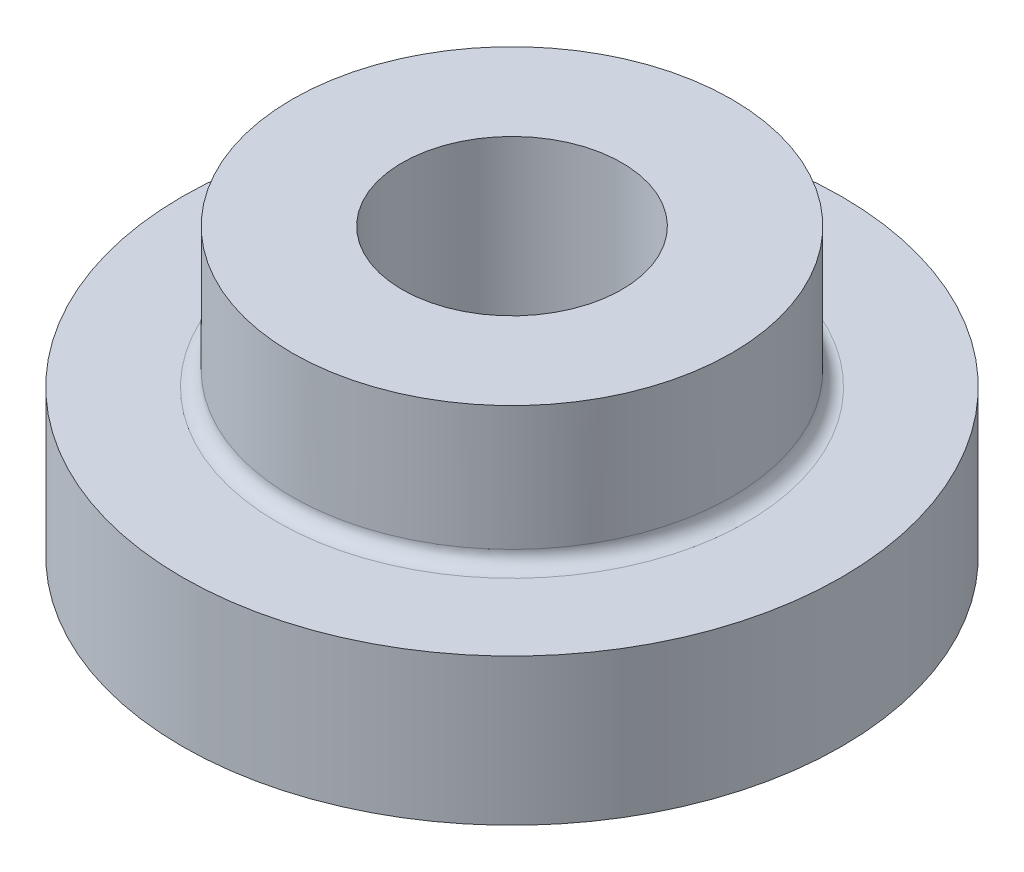
ISO-10303-21;
HEADER;
FILE_DESCRIPTION(('STEP AP214'),'2;1');
FILE_NAME('part.step','',(''),(''),'','','');
FILE_SCHEMA(('AUTOMOTIVE_DESIGN { 1 0 10303 214 1 1 1 1 }'));
ENDSEC;
DATA;
#1=APPLICATION_CONTEXT('core data for automotive mechanical design processes');
#2=APPLICATION_PROTOCOL_DEFINITION('international standard','automotive_design',2000,#1);
#3=PRODUCT_CONTEXT('',#1,'mechanical');
#4=PRODUCT('Part','Part','',(#3));
#5=PRODUCT_RELATED_PRODUCT_CATEGORY('part','',(#4));
#6=PRODUCT_DEFINITION_FORMATION('','',#4);
#7=PRODUCT_DEFINITION_CONTEXT('part definition',#1,'design');
#8=PRODUCT_DEFINITION('design','',#6,#7);
#9=PRODUCT_DEFINITION_SHAPE('','',#8);
#10=(LENGTH_UNIT() NAMED_UNIT(*) SI_UNIT(.MILLI.,.METRE.));
#11=(NAMED_UNIT(*) PLANE_ANGLE_UNIT() SI_UNIT($,.RADIAN.));
#12=(NAMED_UNIT(*) SI_UNIT($,.STERADIAN.) SOLID_ANGLE_UNIT());
#13=UNCERTAINTY_MEASURE_WITH_UNIT(LENGTH_MEASURE(1.E-05),#10,'distance_accuracy_value','');
#14=(GEOMETRIC_REPRESENTATION_CONTEXT(3) GLOBAL_UNCERTAINTY_ASSIGNED_CONTEXT((#13)) GLOBAL_UNIT_ASSIGNED_CONTEXT((#10,
#11,#12)) REPRESENTATION_CONTEXT('',''));
#15=CARTESIAN_POINT('',(0.,0.,0.));
#16=DIRECTION('',(0.,0.,1.));
#17=DIRECTION('',(1.,0.,0.));
#18=AXIS2_PLACEMENT_3D('',#15,#16,#17);
#19=CARTESIAN_POINT('',(0.,2.3,0.));
#20=DIRECTION('',(0.,-1.,0.));
#21=DIRECTION('',(0.,0.,-1.));
#22=AXIS2_PLACEMENT_3D('',#19,#20,#21);
#23=CYLINDRICAL_SURFACE('',#22,3.);
#24=CARTESIAN_POINT('',(0.,0.6,0.));
#25=DIRECTION('',(0.,-1.,0.));
#26=DIRECTION('',(0.,0.,-1.));
#27=AXIS2_PLACEMENT_3D('',#24,#25,#26);
#28=CIRCLE('',#27,3.);
#29=CARTESIAN_POINT('',(0.,0.6,-3.));
#30=VERTEX_POINT('',#29);
#31=EDGE_CURVE('E54',#30,#30,#28,.F.);
#32=ORIENTED_EDGE('',*,*,#31,.T.);
#33=EDGE_LOOP('',(#32));
#34=FACE_BOUND('',#33,.T.);
#35=CARTESIAN_POINT('',(0.,2.3,0.));
#36=DIRECTION('',(0.,1.,0.));
#37=DIRECTION('',(0.,0.,1.));
#38=AXIS2_PLACEMENT_3D('',#35,#36,#37);
#39=CIRCLE('',#38,3.);
#40=CARTESIAN_POINT('',(0.,2.3,3.));
#41=VERTEX_POINT('',#40);
#42=EDGE_CURVE('E65',#41,#41,#39,.T.);
#43=ORIENTED_EDGE('',*,*,#42,.F.);
#44=EDGE_LOOP('',(#43));
#45=FACE_BOUND('',#44,.T.);
#46=ADVANCED_FACE('F41',(#34,#45),#23,.T.);
#47=CARTESIAN_POINT('',(0.,2.3,0.));
#48=DIRECTION('',(0.,1.,0.));
#49=DIRECTION('',(0.,0.,1.));
#50=AXIS2_PLACEMENT_3D('',#47,#48,#49);
#51=PLANE('',#50);
#52=CARTESIAN_POINT('',(0.,2.3,0.));
#53=DIRECTION('',(0.,1.,0.));
#54=DIRECTION('',(0.,0.,1.));
#55=AXIS2_PLACEMENT_3D('',#52,#53,#54);
#56=CIRCLE('',#55,1.5);
#57=CARTESIAN_POINT('',(0.,2.3,1.5));
#58=VERTEX_POINT('',#57);
#59=EDGE_CURVE('E69',#58,#58,#56,.T.);
#60=ORIENTED_EDGE('',*,*,#59,.F.);
#61=EDGE_LOOP('',(#60));
#62=FACE_BOUND('',#61,.T.);
#63=ORIENTED_EDGE('',*,*,#42,.T.);
#64=EDGE_LOOP('',(#63));
#65=FACE_BOUND('',#64,.T.);
#66=ADVANCED_FACE('F108',(#62,#65),#51,.T.);
#67=CARTESIAN_POINT('',(0.,0.,0.));
#68=DIRECTION('',(0.,1.,0.));
#69=DIRECTION('',(0.,0.,1.));
#70=AXIS2_PLACEMENT_3D('',#67,#68,#69);
#71=PLANE('',#70);
#72=CARTESIAN_POINT('',(0.,0.,0.));
#73=DIRECTION('',(0.,1.,0.));
#74=DIRECTION('',(0.,0.,1.));
#75=AXIS2_PLACEMENT_3D('',#72,#73,#74);
#76=CIRCLE('',#75,2.8);
#77=CARTESIAN_POINT('',(0.,0.,2.8));
#78=VERTEX_POINT('',#77);
#79=EDGE_CURVE('E10',#78,#78,#76,.F.);
#80=ORIENTED_EDGE('',*,*,#79,.T.);
#81=EDGE_LOOP('',(#80));
#82=FACE_BOUND('',#81,.T.);
#83=CARTESIAN_POINT('',(0.,0.,0.));
#84=DIRECTION('',(0.,1.,0.));
#85=DIRECTION('',(0.,0.,1.));
#86=AXIS2_PLACEMENT_3D('',#83,#84,#85);
#87=CIRCLE('',#86,1.5);
#88=CARTESIAN_POINT('',(0.,0.,1.5));
#89=VERTEX_POINT('',#88);
#90=EDGE_CURVE('E70',#89,#89,#87,.T.);
#91=ORIENTED_EDGE('',*,*,#90,.T.);
#92=EDGE_LOOP('',(#91));
#93=FACE_BOUND('',#92,.T.);
#94=ADVANCED_FACE('F114',(#82,#93),#71,.F.);
#95=CARTESIAN_POINT('',(0.,2.3,0.));
#96=DIRECTION('',(0.,-1.,0.));
#97=DIRECTION('',(0.,0.,-1.));
#98=AXIS2_PLACEMENT_3D('',#95,#96,#97);
#99=CYLINDRICAL_SURFACE('',#98,1.5);
#100=ORIENTED_EDGE('',*,*,#59,.T.);
#101=EDGE_LOOP('',(#100));
#102=FACE_BOUND('',#101,.T.);
#103=ORIENTED_EDGE('',*,*,#90,.F.);
#104=EDGE_LOOP('',(#103));
#105=FACE_BOUND('',#104,.T.);
#106=ADVANCED_FACE('F120',(#102,#105),#99,.F.);
#107=CARTESIAN_POINT('',(0.,0.4,0.));
#108=DIRECTION('',(0.,-1.,0.));
#109=DIRECTION('',(0.,0.,-1.));
#110=AXIS2_PLACEMENT_3D('',#107,#108,#109);
#111=CYLINDRICAL_SURFACE('',#110,3.);
#112=CARTESIAN_POINT('',(0.,-0.2,0.));
#113=DIRECTION('',(0.,1.,0.));
#114=DIRECTION('',(0.,0.,1.));
#115=AXIS2_PLACEMENT_3D('',#112,#113,#114);
#116=CIRCLE('',#115,3.);
#117=CARTESIAN_POINT('',(0.,-0.2,3.));
#118=VERTEX_POINT('',#117);
#119=EDGE_CURVE('E49',#118,#118,#116,.T.);
#120=ORIENTED_EDGE('',*,*,#119,.T.);
#121=EDGE_LOOP('',(#120));
#122=FACE_BOUND('',#121,.T.);
#123=CARTESIAN_POINT('',(0.,-1.6,0.));
#124=DIRECTION('',(0.,-1.,0.));
#125=DIRECTION('',(0.,0.,-1.));
#126=AXIS2_PLACEMENT_3D('',#123,#124,#125);
#127=CIRCLE('',#126,3.);
#128=CARTESIAN_POINT('',(0.,-1.6,-3.));
#129=VERTEX_POINT('',#128);
#130=EDGE_CURVE('E85',#129,#129,#127,.T.);
#131=ORIENTED_EDGE('',*,*,#130,.T.);
#132=EDGE_LOOP('',(#131));
#133=FACE_BOUND('',#132,.T.);
#134=ADVANCED_FACE('F90',(#122,#133),#111,.F.);
#135=CARTESIAN_POINT('',(0.,0.4,0.));
#136=DIRECTION('',(0.,-1.,0.));
#137=DIRECTION('',(0.,0.,-1.));
#138=AXIS2_PLACEMENT_3D('',#135,#136,#137);
#139=CYLINDRICAL_SURFACE('',#138,4.5);
#140=CARTESIAN_POINT('',(0.,0.4,0.));
#141=DIRECTION('',(0.,-1.,0.));
#142=DIRECTION('',(0.,0.,-1.));
#143=AXIS2_PLACEMENT_3D('',#140,#141,#142);
#144=CIRCLE('',#143,4.5);
#145=CARTESIAN_POINT('',(0.,0.4,-4.5));
#146=VERTEX_POINT('',#145);
#147=EDGE_CURVE('E74',#146,#146,#144,.T.);
#148=ORIENTED_EDGE('',*,*,#147,.T.);
#149=EDGE_LOOP('',(#148));
#150=FACE_BOUND('',#149,.T.);
#151=CARTESIAN_POINT('',(0.,-1.6,0.));
#152=DIRECTION('',(0.,-1.,0.));
#153=DIRECTION('',(0.,0.,-1.));
#154=AXIS2_PLACEMENT_3D('',#151,#152,#153);
#155=CIRCLE('',#154,4.5);
#156=CARTESIAN_POINT('',(0.,-1.6,-4.5));
#157=VERTEX_POINT('',#156);
#158=EDGE_CURVE('E81',#157,#157,#155,.T.);
#159=ORIENTED_EDGE('',*,*,#158,.F.);
#160=EDGE_LOOP('',(#159));
#161=FACE_BOUND('',#160,.T.);
#162=ADVANCED_FACE('F103',(#150,#161),#139,.T.);
#163=CARTESIAN_POINT('',(0.,0.4,0.));
#164=DIRECTION('',(0.,-1.,0.));
#165=DIRECTION('',(0.,0.,-1.));
#166=AXIS2_PLACEMENT_3D('',#163,#164,#165);
#167=PLANE('',#166);
#168=CARTESIAN_POINT('',(0.,0.4,0.));
#169=DIRECTION('',(0.,-1.,0.));
#170=DIRECTION('',(0.,0.,-1.));
#171=AXIS2_PLACEMENT_3D('',#168,#169,#170);
#172=CIRCLE('',#171,3.2);
#173=CARTESIAN_POINT('',(0.,0.4,-3.2));
#174=VERTEX_POINT('',#173);
#175=EDGE_CURVE('E59',#174,#174,#172,.T.);
#176=ORIENTED_EDGE('',*,*,#175,.T.);
#177=EDGE_LOOP('',(#176));
#178=FACE_BOUND('',#177,.T.);
#179=ORIENTED_EDGE('',*,*,#147,.F.);
#180=EDGE_LOOP('',(#179));
#181=FACE_BOUND('',#180,.T.);
#182=ADVANCED_FACE('F95',(#178,#181),#167,.F.);
#183=CARTESIAN_POINT('',(0.,-1.6,0.));
#184=DIRECTION('',(0.,-1.,0.));
#185=DIRECTION('',(0.,0.,-1.));
#186=AXIS2_PLACEMENT_3D('',#183,#184,#185);
#187=PLANE('',#186);
#188=ORIENTED_EDGE('',*,*,#158,.T.);
#189=EDGE_LOOP('',(#188));
#190=FACE_BOUND('',#189,.T.);
#191=ORIENTED_EDGE('',*,*,#130,.F.);
#192=EDGE_LOOP('',(#191));
#193=FACE_BOUND('',#192,.T.);
#194=ADVANCED_FACE('F92',(#190,#193),#187,.T.);
#195=CARTESIAN_POINT('',(0.,0.6,0.));
#196=DIRECTION('',(0.,-1.,0.));
#197=DIRECTION('',(0.,0.,-1.));
#198=AXIS2_PLACEMENT_3D('',#195,#196,#197);
#199=TOROIDAL_SURFACE('',#198,3.2,0.2);
#200=ORIENTED_EDGE('',*,*,#31,.F.);
#201=EDGE_LOOP('',(#200));
#202=FACE_BOUND('',#201,.T.);
#203=ORIENTED_EDGE('',*,*,#175,.F.);
#204=EDGE_LOOP('',(#203));
#205=FACE_BOUND('',#204,.T.);
#206=ADVANCED_FACE('F94',(#202,#205),#199,.F.);
#207=CARTESIAN_POINT('',(0.,-0.2,0.));
#208=DIRECTION('',(0.,1.,0.));
#209=DIRECTION('',(0.,0.,1.));
#210=AXIS2_PLACEMENT_3D('',#207,#208,#209);
#211=TOROIDAL_SURFACE('',#210,2.8,0.2);
#212=ORIENTED_EDGE('',*,*,#79,.F.);
#213=EDGE_LOOP('',(#212));
#214=FACE_BOUND('',#213,.T.);
#215=ORIENTED_EDGE('',*,*,#119,.F.);
#216=EDGE_LOOP('',(#215));
#217=FACE_BOUND('',#216,.T.);
#218=ADVANCED_FACE('F43',(#214,#217),#211,.F.);
#219=CLOSED_SHELL('',(#46,#66,#94,#106,#134,#162,#182,#194,#206,#218));
#220=MANIFOLD_SOLID_BREP('B2',#219);
#221=ADVANCED_BREP_SHAPE_REPRESENTATION('',(#18,#220),#14);
#222=SHAPE_DEFINITION_REPRESENTATION(#9,#221);
ENDSEC;
END-ISO-10303-21;
